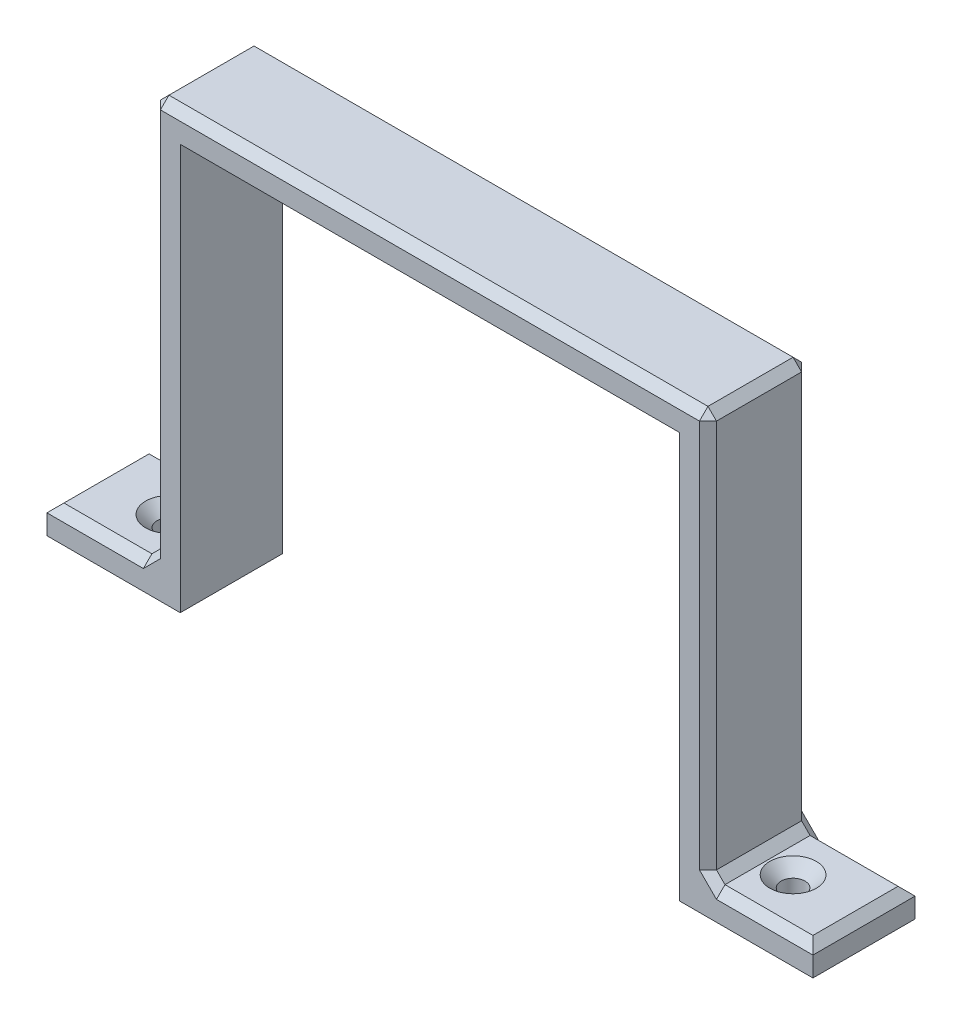
ISO-10303-21;
HEADER;
FILE_DESCRIPTION(('STEP AP214'),'2;1');
FILE_NAME('part.step','',(''),(''),'','','');
FILE_SCHEMA(('AUTOMOTIVE_DESIGN { 1 0 10303 214 1 1 1 1 }'));
ENDSEC;
DATA;
#1=APPLICATION_CONTEXT('core data for automotive mechanical design processes');
#2=APPLICATION_PROTOCOL_DEFINITION('international standard','automotive_design',2000,#1);
#3=PRODUCT_CONTEXT('',#1,'mechanical');
#4=PRODUCT('Part','Part','',(#3));
#5=PRODUCT_RELATED_PRODUCT_CATEGORY('part','',(#4));
#6=PRODUCT_DEFINITION_FORMATION('','',#4);
#7=PRODUCT_DEFINITION_CONTEXT('part definition',#1,'design');
#8=PRODUCT_DEFINITION('design','',#6,#7);
#9=PRODUCT_DEFINITION_SHAPE('','',#8);
#10=(LENGTH_UNIT() NAMED_UNIT(*) SI_UNIT(.MILLI.,.METRE.));
#11=(NAMED_UNIT(*) PLANE_ANGLE_UNIT() SI_UNIT($,.RADIAN.));
#12=(NAMED_UNIT(*) SI_UNIT($,.STERADIAN.) SOLID_ANGLE_UNIT());
#13=UNCERTAINTY_MEASURE_WITH_UNIT(LENGTH_MEASURE(1.E-05),#10,'distance_accuracy_value','');
#14=(GEOMETRIC_REPRESENTATION_CONTEXT(3) GLOBAL_UNCERTAINTY_ASSIGNED_CONTEXT((#13)) GLOBAL_UNIT_ASSIGNED_CONTEXT((#10,
#11,#12)) REPRESENTATION_CONTEXT('',''));
#15=CARTESIAN_POINT('',(0.,0.,0.));
#16=DIRECTION('',(0.,0.,1.));
#17=DIRECTION('',(1.,0.,0.));
#18=AXIS2_PLACEMENT_3D('',#15,#16,#17);
#19=CARTESIAN_POINT('',(0.,0.,-9.));
#20=DIRECTION('',(0.,0.,-1.));
#21=DIRECTION('',(-1.,0.,0.));
#22=AXIS2_PLACEMENT_3D('',#19,#20,#21);
#23=PLANE('',#22);
#24=DIRECTION('',(0.,-1.,0.));
#25=VECTOR('',#24,1.);
#26=CARTESIAN_POINT('',(-67.4999999999999,-22.85,-9.));
#27=LINE('',#26,#25);
#28=CARTESIAN_POINT('',(-67.4999999999999,-24.35,-9.));
#29=VERTEX_POINT('',#28);
#30=CARTESIAN_POINT('',(-67.4999999999999,-27.85,-9.));
#31=VERTEX_POINT('',#30);
#32=EDGE_CURVE('E442',#29,#31,#27,.T.);
#33=ORIENTED_EDGE('',*,*,#32,.F.);
#34=DIRECTION('',(1.,0.,0.));
#35=VECTOR('',#34,1.);
#36=CARTESIAN_POINT('',(-49.,-24.35,-9.));
#37=LINE('',#36,#35);
#38=CARTESIAN_POINT('',(-50.5,-24.35,-9.));
#39=VERTEX_POINT('',#38);
#40=EDGE_CURVE('E331',#29,#39,#37,.T.);
#41=ORIENTED_EDGE('',*,*,#40,.T.);
#42=DIRECTION('',(-0.707106781186544,-0.707106781186551,0.));
#43=VECTOR('',#42,1.);
#44=CARTESIAN_POINT('',(-13.0750000000002,13.0750000000001,-9.));
#45=LINE('',#44,#43);
#46=CARTESIAN_POINT('',(-49.,-22.85,-9.));
#47=VERTEX_POINT('',#46);
#48=EDGE_CURVE('E328',#47,#39,#45,.T.);
#49=ORIENTED_EDGE('',*,*,#48,.F.);
#50=DIRECTION('',(-0.707106781186544,-0.707106781186551,0.));
#51=VECTOR('',#50,1.);
#52=CARTESIAN_POINT('',(-13.0750000000002,13.0750000000001,-9.));
#53=LINE('',#52,#51);
#54=CARTESIAN_POINT('',(-47.5,-21.35,-9.));
#55=VERTEX_POINT('',#54);
#56=EDGE_CURVE('E325',#55,#47,#53,.T.);
#57=ORIENTED_EDGE('',*,*,#56,.F.);
#58=DIRECTION('',(0.,1.,0.));
#59=VECTOR('',#58,1.);
#60=CARTESIAN_POINT('',(-47.5,48.65,-9.));
#61=LINE('',#60,#59);
#62=CARTESIAN_POINT('',(-47.5,47.15,-9.));
#63=VERTEX_POINT('',#62);
#64=EDGE_CURVE('E323',#55,#63,#61,.T.);
#65=ORIENTED_EDGE('',*,*,#64,.T.);
#66=DIRECTION('',(1.,0.,0.));
#67=VECTOR('',#66,1.);
#68=CARTESIAN_POINT('',(49.,47.15,-9.));
#69=LINE('',#68,#67);
#70=CARTESIAN_POINT('',(47.5,47.15,-9.));
#71=VERTEX_POINT('',#70);
#72=EDGE_CURVE('E321',#63,#71,#69,.T.);
#73=ORIENTED_EDGE('',*,*,#72,.T.);
#74=DIRECTION('',(0.,-1.,0.));
#75=VECTOR('',#74,1.);
#76=CARTESIAN_POINT('',(47.5,-22.85,-9.));
#77=LINE('',#76,#75);
#78=CARTESIAN_POINT('',(47.5,-21.35,-9.));
#79=VERTEX_POINT('',#78);
#80=EDGE_CURVE('E319',#71,#79,#77,.T.);
#81=ORIENTED_EDGE('',*,*,#80,.T.);
#82=DIRECTION('',(-0.707106781186543,0.707106781186552,0.));
#83=VECTOR('',#82,1.);
#84=CARTESIAN_POINT('',(13.0750000000003,13.0750000000001,-9.));
#85=LINE('',#84,#83);
#86=CARTESIAN_POINT('',(49.,-22.85,-9.));
#87=VERTEX_POINT('',#86);
#88=EDGE_CURVE('E316',#87,#79,#85,.T.);
#89=ORIENTED_EDGE('',*,*,#88,.F.);
#90=DIRECTION('',(-0.707106781186543,0.707106781186552,0.));
#91=VECTOR('',#90,1.);
#92=CARTESIAN_POINT('',(13.0750000000003,13.0750000000001,-9.));
#93=LINE('',#92,#91);
#94=CARTESIAN_POINT('',(50.5,-24.35,-9.));
#95=VERTEX_POINT('',#94);
#96=EDGE_CURVE('E313',#95,#87,#93,.T.);
#97=ORIENTED_EDGE('',*,*,#96,.F.);
#98=DIRECTION('',(1.,0.,0.));
#99=VECTOR('',#98,1.);
#100=CARTESIAN_POINT('',(67.5,-24.35,-9.));
#101=LINE('',#100,#99);
#102=CARTESIAN_POINT('',(67.5,-24.35,-9.));
#103=VERTEX_POINT('',#102);
#104=EDGE_CURVE('E311',#95,#103,#101,.T.);
#105=ORIENTED_EDGE('',*,*,#104,.T.);
#106=DIRECTION('',(0.,1.,0.));
#107=VECTOR('',#106,1.);
#108=CARTESIAN_POINT('',(67.5,-22.85,-9.));
#109=LINE('',#108,#107);
#110=CARTESIAN_POINT('',(67.5,-27.85,-9.));
#111=VERTEX_POINT('',#110);
#112=EDGE_CURVE('E448',#111,#103,#109,.T.);
#113=ORIENTED_EDGE('',*,*,#112,.F.);
#114=DIRECTION('',(1.,0.,0.));
#115=VECTOR('',#114,1.);
#116=CARTESIAN_POINT('',(67.5,-27.85,-9.));
#117=LINE('',#116,#115);
#118=CARTESIAN_POINT('',(44.,-27.85,-9.));
#119=VERTEX_POINT('',#118);
#120=EDGE_CURVE('E237',#119,#111,#117,.T.);
#121=ORIENTED_EDGE('',*,*,#120,.F.);
#122=DIRECTION('',(0.,-1.,0.));
#123=VECTOR('',#122,1.);
#124=CARTESIAN_POINT('',(44.,-27.85,-9.));
#125=LINE('',#124,#123);
#126=CARTESIAN_POINT('',(44.,43.65,-9.));
#127=VERTEX_POINT('',#126);
#128=EDGE_CURVE('E233',#127,#119,#125,.T.);
#129=ORIENTED_EDGE('',*,*,#128,.F.);
#130=DIRECTION('',(1.,0.,0.));
#131=VECTOR('',#130,1.);
#132=CARTESIAN_POINT('',(44.,43.65,-9.));
#133=LINE('',#132,#131);
#134=CARTESIAN_POINT('',(-44.,43.65,-9.));
#135=VERTEX_POINT('',#134);
#136=EDGE_CURVE('E456',#135,#127,#133,.T.);
#137=ORIENTED_EDGE('',*,*,#136,.F.);
#138=DIRECTION('',(0.,1.,0.));
#139=VECTOR('',#138,1.);
#140=CARTESIAN_POINT('',(-44.,-27.85,-9.));
#141=LINE('',#140,#139);
#142=CARTESIAN_POINT('',(-44.,-27.85,-9.));
#143=VERTEX_POINT('',#142);
#144=EDGE_CURVE('E450',#143,#135,#141,.T.);
#145=ORIENTED_EDGE('',*,*,#144,.F.);
#146=DIRECTION('',(1.,0.,0.));
#147=VECTOR('',#146,1.);
#148=CARTESIAN_POINT('',(-67.4999999999999,-27.85,-9.));
#149=LINE('',#148,#147);
#150=EDGE_CURVE('E447',#31,#143,#149,.T.);
#151=ORIENTED_EDGE('',*,*,#150,.F.);
#152=EDGE_LOOP('',(#33,#41,#49,#57,#65,#73,#81,#89,#97,#105,#113,#121,#129,#137,#145,#151));
#153=FACE_BOUND('',#152,.T.);
#154=ADVANCED_FACE('F39',(#153),#23,.T.);
#155=CARTESIAN_POINT('',(0.,0.,9.));
#156=DIRECTION('',(0.,0.,-1.));
#157=DIRECTION('',(-1.,0.,0.));
#158=AXIS2_PLACEMENT_3D('',#155,#156,#157);
#159=PLANE('',#158);
#160=DIRECTION('',(0.707106781186544,0.707106781186551,0.));
#161=VECTOR('',#160,1.);
#162=CARTESIAN_POINT('',(-47.5,-21.35,9.));
#163=LINE('',#162,#161);
#164=CARTESIAN_POINT('',(-50.5,-24.35,9.));
#165=VERTEX_POINT('',#164);
#166=CARTESIAN_POINT('',(-49.,-22.85,9.));
#167=VERTEX_POINT('',#166);
#168=EDGE_CURVE('E297',#165,#167,#163,.T.);
#169=ORIENTED_EDGE('',*,*,#168,.F.);
#170=DIRECTION('',(-1.,0.,0.));
#171=VECTOR('',#170,1.);
#172=CARTESIAN_POINT('',(0.,-24.35,9.));
#173=LINE('',#172,#171);
#174=CARTESIAN_POINT('',(-67.4999999999999,-24.35,9.));
#175=VERTEX_POINT('',#174);
#176=EDGE_CURVE('E300',#165,#175,#173,.T.);
#177=ORIENTED_EDGE('',*,*,#176,.T.);
#178=DIRECTION('',(0.,-1.,0.));
#179=VECTOR('',#178,1.);
#180=CARTESIAN_POINT('',(-67.4999999999999,-22.85,9.));
#181=LINE('',#180,#179);
#182=CARTESIAN_POINT('',(-67.4999999999999,-27.85,9.));
#183=VERTEX_POINT('',#182);
#184=EDGE_CURVE('E223',#175,#183,#181,.T.);
#185=ORIENTED_EDGE('',*,*,#184,.T.);
#186=DIRECTION('',(1.,0.,0.));
#187=VECTOR('',#186,1.);
#188=CARTESIAN_POINT('',(-67.4999999999999,-27.85,9.));
#189=LINE('',#188,#187);
#190=CARTESIAN_POINT('',(-44.,-27.85,9.));
#191=VERTEX_POINT('',#190);
#192=EDGE_CURVE('E493',#183,#191,#189,.T.);
#193=ORIENTED_EDGE('',*,*,#192,.T.);
#194=DIRECTION('',(0.,1.,0.));
#195=VECTOR('',#194,1.);
#196=CARTESIAN_POINT('',(-44.,-27.85,9.));
#197=LINE('',#196,#195);
#198=CARTESIAN_POINT('',(-44.,43.65,9.));
#199=VERTEX_POINT('',#198);
#200=EDGE_CURVE('E472',#191,#199,#197,.T.);
#201=ORIENTED_EDGE('',*,*,#200,.T.);
#202=DIRECTION('',(1.,0.,0.));
#203=VECTOR('',#202,1.);
#204=CARTESIAN_POINT('',(44.,43.65,9.));
#205=LINE('',#204,#203);
#206=CARTESIAN_POINT('',(44.,43.65,9.));
#207=VERTEX_POINT('',#206);
#208=EDGE_CURVE('E483',#199,#207,#205,.T.);
#209=ORIENTED_EDGE('',*,*,#208,.T.);
#210=DIRECTION('',(0.,-1.,0.));
#211=VECTOR('',#210,1.);
#212=CARTESIAN_POINT('',(44.,-27.85,9.));
#213=LINE('',#212,#211);
#214=CARTESIAN_POINT('',(44.,-27.85,9.));
#215=VERTEX_POINT('',#214);
#216=EDGE_CURVE('E229',#207,#215,#213,.T.);
#217=ORIENTED_EDGE('',*,*,#216,.T.);
#218=DIRECTION('',(1.,0.,0.));
#219=VECTOR('',#218,1.);
#220=CARTESIAN_POINT('',(67.5,-27.85,9.));
#221=LINE('',#220,#219);
#222=CARTESIAN_POINT('',(67.5,-27.85,9.));
#223=VERTEX_POINT('',#222);
#224=EDGE_CURVE('E224',#215,#223,#221,.T.);
#225=ORIENTED_EDGE('',*,*,#224,.T.);
#226=DIRECTION('',(0.,1.,0.));
#227=VECTOR('',#226,1.);
#228=CARTESIAN_POINT('',(67.5,-22.85,9.));
#229=LINE('',#228,#227);
#230=CARTESIAN_POINT('',(67.5,-24.35,9.));
#231=VERTEX_POINT('',#230);
#232=EDGE_CURVE('E213',#223,#231,#229,.T.);
#233=ORIENTED_EDGE('',*,*,#232,.T.);
#234=DIRECTION('',(-1.,0.,0.));
#235=VECTOR('',#234,1.);
#236=CARTESIAN_POINT('',(0.,-24.35,9.));
#237=LINE('',#236,#235);
#238=CARTESIAN_POINT('',(50.5,-24.35,9.));
#239=VERTEX_POINT('',#238);
#240=EDGE_CURVE('E285',#231,#239,#237,.T.);
#241=ORIENTED_EDGE('',*,*,#240,.T.);
#242=DIRECTION('',(0.707106781186543,-0.707106781186552,0.));
#243=VECTOR('',#242,1.);
#244=CARTESIAN_POINT('',(50.5,-24.35,9.));
#245=LINE('',#244,#243);
#246=CARTESIAN_POINT('',(49.,-22.85,9.));
#247=VERTEX_POINT('',#246);
#248=EDGE_CURVE('E279',#247,#239,#245,.T.);
#249=ORIENTED_EDGE('',*,*,#248,.F.);
#250=DIRECTION('',(0.707106781186543,-0.707106781186552,0.));
#251=VECTOR('',#250,1.);
#252=CARTESIAN_POINT('',(50.5,-24.35,9.));
#253=LINE('',#252,#251);
#254=CARTESIAN_POINT('',(47.5,-21.35,9.));
#255=VERTEX_POINT('',#254);
#256=EDGE_CURVE('E282',#255,#247,#253,.T.);
#257=ORIENTED_EDGE('',*,*,#256,.F.);
#258=DIRECTION('',(0.,1.,0.));
#259=VECTOR('',#258,1.);
#260=CARTESIAN_POINT('',(47.5,0.,9.));
#261=LINE('',#260,#259);
#262=CARTESIAN_POINT('',(47.5,47.15,9.));
#263=VERTEX_POINT('',#262);
#264=EDGE_CURVE('E287',#255,#263,#261,.T.);
#265=ORIENTED_EDGE('',*,*,#264,.T.);
#266=DIRECTION('',(-1.,0.,0.));
#267=VECTOR('',#266,1.);
#268=CARTESIAN_POINT('',(0.,47.15,9.));
#269=LINE('',#268,#267);
#270=CARTESIAN_POINT('',(-47.5,47.15,9.));
#271=VERTEX_POINT('',#270);
#272=EDGE_CURVE('E289',#263,#271,#269,.T.);
#273=ORIENTED_EDGE('',*,*,#272,.T.);
#274=DIRECTION('',(0.,-1.,0.));
#275=VECTOR('',#274,1.);
#276=CARTESIAN_POINT('',(-47.5,0.,9.));
#277=LINE('',#276,#275);
#278=CARTESIAN_POINT('',(-47.5,-21.35,9.));
#279=VERTEX_POINT('',#278);
#280=EDGE_CURVE('E292',#271,#279,#277,.T.);
#281=ORIENTED_EDGE('',*,*,#280,.T.);
#282=DIRECTION('',(0.707106781186544,0.707106781186551,0.));
#283=VECTOR('',#282,1.);
#284=CARTESIAN_POINT('',(-47.5,-21.35,9.));
#285=LINE('',#284,#283);
#286=EDGE_CURVE('E294',#167,#279,#285,.T.);
#287=ORIENTED_EDGE('',*,*,#286,.F.);
#288=EDGE_LOOP('',(#169,#177,#185,#193,#201,#209,#217,#225,#233,#241,#249,#257,#265,#273,#281,#287));
#289=FACE_BOUND('',#288,.T.);
#290=ADVANCED_FACE('F227',(#289),#159,.F.);
#291=CARTESIAN_POINT('',(67.5,-27.85,9.));
#292=DIRECTION('',(0.,1.,0.));
#293=DIRECTION('',(-1.,0.,0.));
#294=AXIS2_PLACEMENT_3D('',#291,#292,#293);
#295=PLANE('',#294);
#296=CARTESIAN_POINT('',(55.,-27.85,0.));
#297=DIRECTION('',(0.,1.,0.));
#298=DIRECTION('',(-1.,0.,0.));
#299=AXIS2_PLACEMENT_3D('',#296,#297,#298);
#300=CIRCLE('',#299,2.1);
#301=CARTESIAN_POINT('',(52.9,-27.85,0.));
#302=VERTEX_POINT('',#301);
#303=EDGE_CURVE('E251',#302,#302,#300,.T.);
#304=ORIENTED_EDGE('',*,*,#303,.T.);
#305=EDGE_LOOP('',(#304));
#306=FACE_BOUND('',#305,.T.);
#307=ORIENTED_EDGE('',*,*,#120,.T.);
#308=DIRECTION('',(0.,0.,-1.));
#309=VECTOR('',#308,1.);
#310=CARTESIAN_POINT('',(67.5,-27.85,9.));
#311=LINE('',#310,#309);
#312=EDGE_CURVE('E218',#223,#111,#311,.T.);
#313=ORIENTED_EDGE('',*,*,#312,.F.);
#314=ORIENTED_EDGE('',*,*,#224,.F.);
#315=DIRECTION('',(0.,0.,-1.));
#316=VECTOR('',#315,1.);
#317=CARTESIAN_POINT('',(44.,-27.85,9.));
#318=LINE('',#317,#316);
#319=EDGE_CURVE('E459',#215,#119,#318,.T.);
#320=ORIENTED_EDGE('',*,*,#319,.T.);
#321=EDGE_LOOP('',(#307,#313,#314,#320));
#322=FACE_BOUND('',#321,.T.);
#323=ADVANCED_FACE('F235',(#306,#322),#295,.F.);
#324=CARTESIAN_POINT('',(67.5,-22.85,9.));
#325=DIRECTION('',(-1.,0.,0.));
#326=DIRECTION('',(0.,0.,1.));
#327=AXIS2_PLACEMENT_3D('',#324,#325,#326);
#328=PLANE('',#327);
#329=ORIENTED_EDGE('',*,*,#112,.T.);
#330=DIRECTION('',(0.,0.,1.));
#331=VECTOR('',#330,1.);
#332=CARTESIAN_POINT('',(67.5,-24.35,9.));
#333=LINE('',#332,#331);
#334=EDGE_CURVE('E11',#103,#231,#333,.T.);
#335=ORIENTED_EDGE('',*,*,#334,.T.);
#336=ORIENTED_EDGE('',*,*,#232,.F.);
#337=ORIENTED_EDGE('',*,*,#312,.T.);
#338=EDGE_LOOP('',(#329,#335,#336,#337));
#339=FACE_BOUND('',#338,.T.);
#340=ADVANCED_FACE('F216',(#339),#328,.F.);
#341=CARTESIAN_POINT('',(49.,-22.85,9.));
#342=DIRECTION('',(0.,-1.,0.));
#343=DIRECTION('',(0.,0.,-1.));
#344=AXIS2_PLACEMENT_3D('',#341,#342,#343);
#345=PLANE('',#344);
#346=DIRECTION('',(1.,0.,0.));
#347=VECTOR('',#346,1.);
#348=CARTESIAN_POINT('',(49.,-22.85,7.50000000000001));
#349=LINE('',#348,#347);
#350=CARTESIAN_POINT('',(50.5,-22.85,7.50000000000001));
#351=VERTEX_POINT('',#350);
#352=CARTESIAN_POINT('',(66.,-22.85,7.50000000000001));
#353=VERTEX_POINT('',#352);
#354=EDGE_CURVE('E57',#351,#353,#349,.T.);
#355=ORIENTED_EDGE('',*,*,#354,.T.);
#356=DIRECTION('',(0.,0.,-1.));
#357=VECTOR('',#356,1.);
#358=CARTESIAN_POINT('',(66.,-22.85,9.));
#359=LINE('',#358,#357);
#360=CARTESIAN_POINT('',(66.,-22.85,-7.50000000000001));
#361=VERTEX_POINT('',#360);
#362=EDGE_CURVE('E49',#353,#361,#359,.T.);
#363=ORIENTED_EDGE('',*,*,#362,.T.);
#364=DIRECTION('',(-1.,0.,0.));
#365=VECTOR('',#364,1.);
#366=CARTESIAN_POINT('',(49.,-22.85,-7.50000000000001));
#367=LINE('',#366,#365);
#368=CARTESIAN_POINT('',(50.5,-22.85,-7.50000000000001));
#369=VERTEX_POINT('',#368);
#370=EDGE_CURVE('E344',#361,#369,#367,.T.);
#371=ORIENTED_EDGE('',*,*,#370,.T.);
#372=DIRECTION('',(0.,0.,1.));
#373=VECTOR('',#372,1.);
#374=CARTESIAN_POINT('',(50.5,-22.85,9.));
#375=LINE('',#374,#373);
#376=EDGE_CURVE('E62',#369,#351,#375,.T.);
#377=ORIENTED_EDGE('',*,*,#376,.T.);
#378=EDGE_LOOP('',(#355,#363,#371,#377));
#379=FACE_BOUND('',#378,.T.);
#380=CARTESIAN_POINT('',(55.,-22.85,0.));
#381=DIRECTION('',(0.,-1.,0.));
#382=DIRECTION('',(0.,0.,-1.));
#383=AXIS2_PLACEMENT_3D('',#380,#381,#382);
#384=CIRCLE('',#383,4.10000000000001);
#385=CARTESIAN_POINT('',(55.,-22.85,-4.10000000000001));
#386=VERTEX_POINT('',#385);
#387=EDGE_CURVE('E255',#386,#386,#384,.T.);
#388=ORIENTED_EDGE('',*,*,#387,.T.);
#389=EDGE_LOOP('',(#388));
#390=FACE_BOUND('',#389,.T.);
#391=ADVANCED_FACE('F934',(#379,#390),#345,.F.);
#392=CARTESIAN_POINT('',(49.,48.65,9.));
#393=DIRECTION('',(-1.,0.,0.));
#394=DIRECTION('',(0.,-1.,0.));
#395=AXIS2_PLACEMENT_3D('',#392,#393,#394);
#396=PLANE('',#395);
#397=DIRECTION('',(0.,1.,0.));
#398=VECTOR('',#397,1.);
#399=CARTESIAN_POINT('',(49.,48.65,-7.5));
#400=LINE('',#399,#398);
#401=CARTESIAN_POINT('',(49.,-21.35,-7.5));
#402=VERTEX_POINT('',#401);
#403=CARTESIAN_POINT('',(49.,47.15,-7.5));
#404=VERTEX_POINT('',#403);
#405=EDGE_CURVE('E272',#402,#404,#400,.T.);
#406=ORIENTED_EDGE('',*,*,#405,.T.);
#407=DIRECTION('',(0.,0.,1.));
#408=VECTOR('',#407,1.);
#409=CARTESIAN_POINT('',(49.,47.15,9.));
#410=LINE('',#409,#408);
#411=CARTESIAN_POINT('',(49.,47.15,7.50000000000001));
#412=VERTEX_POINT('',#411);
#413=EDGE_CURVE('E276',#404,#412,#410,.T.);
#414=ORIENTED_EDGE('',*,*,#413,.T.);
#415=DIRECTION('',(0.,-1.,0.));
#416=VECTOR('',#415,1.);
#417=CARTESIAN_POINT('',(49.,48.65,7.50000000000001));
#418=LINE('',#417,#416);
#419=CARTESIAN_POINT('',(49.,-21.35,7.50000000000001));
#420=VERTEX_POINT('',#419);
#421=EDGE_CURVE('E274',#412,#420,#418,.T.);
#422=ORIENTED_EDGE('',*,*,#421,.T.);
#423=DIRECTION('',(0.,0.,-1.));
#424=VECTOR('',#423,1.);
#425=CARTESIAN_POINT('',(49.,-21.35,-9.));
#426=LINE('',#425,#424);
#427=EDGE_CURVE('E270',#420,#402,#426,.T.);
#428=ORIENTED_EDGE('',*,*,#427,.T.);
#429=EDGE_LOOP('',(#406,#414,#422,#428));
#430=FACE_BOUND('',#429,.T.);
#431=ADVANCED_FACE('F923',(#430),#396,.F.);
#432=CARTESIAN_POINT('',(-49.,48.65,9.));
#433=DIRECTION('',(0.,-1.,0.));
#434=DIRECTION('',(1.,0.,0.));
#435=AXIS2_PLACEMENT_3D('',#432,#433,#434);
#436=PLANE('',#435);
#437=DIRECTION('',(1.,0.,0.));
#438=VECTOR('',#437,1.);
#439=CARTESIAN_POINT('',(-49.,48.65,7.49999999999998));
#440=LINE('',#439,#438);
#441=CARTESIAN_POINT('',(-47.5,48.65,7.49999999999998));
#442=VERTEX_POINT('',#441);
#443=CARTESIAN_POINT('',(47.5,48.65,7.49999999999998));
#444=VERTEX_POINT('',#443);
#445=EDGE_CURVE('E265',#442,#444,#440,.T.);
#446=ORIENTED_EDGE('',*,*,#445,.T.);
#447=DIRECTION('',(0.,0.,-1.));
#448=VECTOR('',#447,1.);
#449=CARTESIAN_POINT('',(47.5,48.65,9.));
#450=LINE('',#449,#448);
#451=CARTESIAN_POINT('',(47.5,48.65,-7.49999999999998));
#452=VERTEX_POINT('',#451);
#453=EDGE_CURVE('E267',#444,#452,#450,.T.);
#454=ORIENTED_EDGE('',*,*,#453,.T.);
#455=DIRECTION('',(-1.,0.,0.));
#456=VECTOR('',#455,1.);
#457=CARTESIAN_POINT('',(-49.,48.65,-7.49999999999998));
#458=LINE('',#457,#456);
#459=CARTESIAN_POINT('',(-47.5,48.65,-7.49999999999998));
#460=VERTEX_POINT('',#459);
#461=EDGE_CURVE('E261',#452,#460,#458,.T.);
#462=ORIENTED_EDGE('',*,*,#461,.T.);
#463=DIRECTION('',(0.,0.,1.));
#464=VECTOR('',#463,1.);
#465=CARTESIAN_POINT('',(-47.5,48.65,9.));
#466=LINE('',#465,#464);
#467=EDGE_CURVE('E263',#460,#442,#466,.T.);
#468=ORIENTED_EDGE('',*,*,#467,.T.);
#469=EDGE_LOOP('',(#446,#454,#462,#468));
#470=FACE_BOUND('',#469,.T.);
#471=ADVANCED_FACE('F912',(#470),#436,.F.);
#472=CARTESIAN_POINT('',(-49.,48.65,9.));
#473=DIRECTION('',(1.,0.,0.));
#474=DIRECTION('',(0.,1.,0.));
#475=AXIS2_PLACEMENT_3D('',#472,#473,#474);
#476=PLANE('',#475);
#477=DIRECTION('',(0.,1.,0.));
#478=VECTOR('',#477,1.);
#479=CARTESIAN_POINT('',(-49.,48.65,7.49999999999997));
#480=LINE('',#479,#478);
#481=CARTESIAN_POINT('',(-49.,-21.35,7.49999999999997));
#482=VERTEX_POINT('',#481);
#483=CARTESIAN_POINT('',(-49.,47.15,7.49999999999997));
#484=VERTEX_POINT('',#483);
#485=EDGE_CURVE('E306',#482,#484,#480,.T.);
#486=ORIENTED_EDGE('',*,*,#485,.T.);
#487=DIRECTION('',(0.,0.,-1.));
#488=VECTOR('',#487,1.);
#489=CARTESIAN_POINT('',(-49.,47.15,9.));
#490=LINE('',#489,#488);
#491=CARTESIAN_POINT('',(-49.,47.15,-7.49999999999997));
#492=VERTEX_POINT('',#491);
#493=EDGE_CURVE('E308',#484,#492,#490,.T.);
#494=ORIENTED_EDGE('',*,*,#493,.T.);
#495=DIRECTION('',(0.,-1.,0.));
#496=VECTOR('',#495,1.);
#497=CARTESIAN_POINT('',(-49.,-22.85,-7.49999999999997));
#498=LINE('',#497,#496);
#499=CARTESIAN_POINT('',(-49.,-21.35,-7.49999999999997));
#500=VERTEX_POINT('',#499);
#501=EDGE_CURVE('E304',#492,#500,#498,.T.);
#502=ORIENTED_EDGE('',*,*,#501,.T.);
#503=DIRECTION('',(0.,0.,1.));
#504=VECTOR('',#503,1.);
#505=CARTESIAN_POINT('',(-49.,-21.35,9.));
#506=LINE('',#505,#504);
#507=EDGE_CURVE('E302',#500,#482,#506,.T.);
#508=ORIENTED_EDGE('',*,*,#507,.T.);
#509=EDGE_LOOP('',(#486,#494,#502,#508));
#510=FACE_BOUND('',#509,.T.);
#511=ADVANCED_FACE('F901',(#510),#476,.F.);
#512=CARTESIAN_POINT('',(-49.,-22.85,9.));
#513=DIRECTION('',(0.,-1.,0.));
#514=DIRECTION('',(1.,0.,0.));
#515=AXIS2_PLACEMENT_3D('',#512,#513,#514);
#516=PLANE('',#515);
#517=DIRECTION('',(1.,0.,0.));
#518=VECTOR('',#517,1.);
#519=CARTESIAN_POINT('',(-49.,-22.85,7.49999999999998));
#520=LINE('',#519,#518);
#521=CARTESIAN_POINT('',(-65.9999999999999,-22.85,7.49999999999998));
#522=VERTEX_POINT('',#521);
#523=CARTESIAN_POINT('',(-50.5,-22.85,7.49999999999998));
#524=VERTEX_POINT('',#523);
#525=EDGE_CURVE('E337',#522,#524,#520,.T.);
#526=ORIENTED_EDGE('',*,*,#525,.T.);
#527=DIRECTION('',(0.,0.,-1.));
#528=VECTOR('',#527,1.);
#529=CARTESIAN_POINT('',(-50.5,-22.85,-9.));
#530=LINE('',#529,#528);
#531=CARTESIAN_POINT('',(-50.5,-22.85,-7.49999999999998));
#532=VERTEX_POINT('',#531);
#533=EDGE_CURVE('E339',#524,#532,#530,.T.);
#534=ORIENTED_EDGE('',*,*,#533,.T.);
#535=DIRECTION('',(-1.,0.,0.));
#536=VECTOR('',#535,1.);
#537=CARTESIAN_POINT('',(-67.4999999999999,-22.85,-7.49999999999998));
#538=LINE('',#537,#536);
#539=CARTESIAN_POINT('',(-65.9999999999999,-22.85,-7.49999999999998));
#540=VERTEX_POINT('',#539);
#541=EDGE_CURVE('E333',#532,#540,#538,.T.);
#542=ORIENTED_EDGE('',*,*,#541,.T.);
#543=DIRECTION('',(0.,0.,1.));
#544=VECTOR('',#543,1.);
#545=CARTESIAN_POINT('',(-65.9999999999999,-22.85,9.));
#546=LINE('',#545,#544);
#547=EDGE_CURVE('E335',#540,#522,#546,.T.);
#548=ORIENTED_EDGE('',*,*,#547,.T.);
#549=EDGE_LOOP('',(#526,#534,#542,#548));
#550=FACE_BOUND('',#549,.T.);
#551=CARTESIAN_POINT('',(-55.,-22.85,0.));
#552=DIRECTION('',(0.,-1.,0.));
#553=DIRECTION('',(1.,0.,0.));
#554=AXIS2_PLACEMENT_3D('',#551,#552,#553);
#555=CIRCLE('',#554,4.10000000000003);
#556=CARTESIAN_POINT('',(-50.8999999999999,-22.85,0.));
#557=VERTEX_POINT('',#556);
#558=EDGE_CURVE('E238',#557,#557,#555,.T.);
#559=ORIENTED_EDGE('',*,*,#558,.T.);
#560=EDGE_LOOP('',(#559));
#561=FACE_BOUND('',#560,.T.);
#562=ADVANCED_FACE('F503',(#550,#561),#516,.F.);
#563=CARTESIAN_POINT('',(-67.4999999999999,-22.85,9.));
#564=DIRECTION('',(1.,0.,0.));
#565=DIRECTION('',(0.,0.,-1.));
#566=AXIS2_PLACEMENT_3D('',#563,#564,#565);
#567=PLANE('',#566);
#568=ORIENTED_EDGE('',*,*,#184,.F.);
#569=DIRECTION('',(0.,0.,-1.));
#570=VECTOR('',#569,1.);
#571=CARTESIAN_POINT('',(-67.4999999999999,-24.35,9.));
#572=LINE('',#571,#570);
#573=EDGE_CURVE('E342',#175,#29,#572,.T.);
#574=ORIENTED_EDGE('',*,*,#573,.T.);
#575=ORIENTED_EDGE('',*,*,#32,.T.);
#576=DIRECTION('',(0.,0.,-1.));
#577=VECTOR('',#576,1.);
#578=CARTESIAN_POINT('',(-67.4999999999999,-27.85,9.));
#579=LINE('',#578,#577);
#580=EDGE_CURVE('E239',#183,#31,#579,.T.);
#581=ORIENTED_EDGE('',*,*,#580,.F.);
#582=EDGE_LOOP('',(#568,#574,#575,#581));
#583=FACE_BOUND('',#582,.T.);
#584=ADVANCED_FACE('F440',(#583),#567,.F.);
#585=CARTESIAN_POINT('',(-67.4999999999999,-27.85,9.));
#586=DIRECTION('',(0.,1.,0.));
#587=DIRECTION('',(-1.,0.,0.));
#588=AXIS2_PLACEMENT_3D('',#585,#586,#587);
#589=PLANE('',#588);
#590=CARTESIAN_POINT('',(-55.,-27.85,0.));
#591=DIRECTION('',(0.,1.,0.));
#592=DIRECTION('',(-1.,0.,0.));
#593=AXIS2_PLACEMENT_3D('',#590,#591,#592);
#594=CIRCLE('',#593,2.1);
#595=CARTESIAN_POINT('',(-57.1,-27.85,0.));
#596=VERTEX_POINT('',#595);
#597=EDGE_CURVE('E249',#596,#596,#594,.T.);
#598=ORIENTED_EDGE('',*,*,#597,.T.);
#599=EDGE_LOOP('',(#598));
#600=FACE_BOUND('',#599,.T.);
#601=ORIENTED_EDGE('',*,*,#150,.T.);
#602=DIRECTION('',(0.,0.,-1.));
#603=VECTOR('',#602,1.);
#604=CARTESIAN_POINT('',(-44.,-27.85,9.));
#605=LINE('',#604,#603);
#606=EDGE_CURVE('E245',#191,#143,#605,.T.);
#607=ORIENTED_EDGE('',*,*,#606,.F.);
#608=ORIENTED_EDGE('',*,*,#192,.F.);
#609=ORIENTED_EDGE('',*,*,#580,.T.);
#610=EDGE_LOOP('',(#601,#607,#608,#609));
#611=FACE_BOUND('',#610,.T.);
#612=ADVANCED_FACE('F494',(#600,#611),#589,.F.);
#613=CARTESIAN_POINT('',(-44.,-27.85,9.));
#614=DIRECTION('',(-1.,0.,0.));
#615=DIRECTION('',(0.,-1.,0.));
#616=AXIS2_PLACEMENT_3D('',#613,#614,#615);
#617=PLANE('',#616);
#618=ORIENTED_EDGE('',*,*,#144,.T.);
#619=DIRECTION('',(0.,0.,-1.));
#620=VECTOR('',#619,1.);
#621=CARTESIAN_POINT('',(-44.,43.65,9.));
#622=LINE('',#621,#620);
#623=EDGE_CURVE('E464',#199,#135,#622,.T.);
#624=ORIENTED_EDGE('',*,*,#623,.F.);
#625=ORIENTED_EDGE('',*,*,#200,.F.);
#626=ORIENTED_EDGE('',*,*,#606,.T.);
#627=EDGE_LOOP('',(#618,#624,#625,#626));
#628=FACE_BOUND('',#627,.T.);
#629=ADVANCED_FACE('F470',(#628),#617,.F.);
#630=CARTESIAN_POINT('',(44.,43.65,9.));
#631=DIRECTION('',(0.,1.,0.));
#632=DIRECTION('',(-1.,0.,0.));
#633=AXIS2_PLACEMENT_3D('',#630,#631,#632);
#634=PLANE('',#633);
#635=ORIENTED_EDGE('',*,*,#136,.T.);
#636=DIRECTION('',(0.,0.,-1.));
#637=VECTOR('',#636,1.);
#638=CARTESIAN_POINT('',(44.,43.65,9.));
#639=LINE('',#638,#637);
#640=EDGE_CURVE('E461',#207,#127,#639,.T.);
#641=ORIENTED_EDGE('',*,*,#640,.F.);
#642=ORIENTED_EDGE('',*,*,#208,.F.);
#643=ORIENTED_EDGE('',*,*,#623,.T.);
#644=EDGE_LOOP('',(#635,#641,#642,#643));
#645=FACE_BOUND('',#644,.T.);
#646=ADVANCED_FACE('F479',(#645),#634,.F.);
#647=CARTESIAN_POINT('',(44.,-27.85,9.));
#648=DIRECTION('',(1.,0.,0.));
#649=DIRECTION('',(0.,0.,-1.));
#650=AXIS2_PLACEMENT_3D('',#647,#648,#649);
#651=PLANE('',#650);
#652=ORIENTED_EDGE('',*,*,#128,.T.);
#653=ORIENTED_EDGE('',*,*,#319,.F.);
#654=ORIENTED_EDGE('',*,*,#216,.F.);
#655=ORIENTED_EDGE('',*,*,#640,.T.);
#656=EDGE_LOOP('',(#652,#653,#654,#655));
#657=FACE_BOUND('',#656,.T.);
#658=ADVANCED_FACE('F482',(#657),#651,.F.);
#659=CARTESIAN_POINT('',(-55.,-18.85,0.));
#660=DIRECTION('',(0.,-1.,0.));
#661=DIRECTION('',(0.,0.,-1.));
#662=AXIS2_PLACEMENT_3D('',#659,#660,#661);
#663=CYLINDRICAL_SURFACE('',#662,2.1);
#664=CARTESIAN_POINT('',(-55.,-24.8500000000001,0.));
#665=DIRECTION('',(0.,-1.,0.));
#666=DIRECTION('',(0.,0.,-1.));
#667=AXIS2_PLACEMENT_3D('',#664,#665,#666);
#668=CIRCLE('',#667,2.1);
#669=CARTESIAN_POINT('',(-55.,-24.8500000000001,-2.10000000000001));
#670=VERTEX_POINT('',#669);
#671=EDGE_CURVE('E242',#670,#670,#668,.F.);
#672=ORIENTED_EDGE('',*,*,#671,.T.);
#673=EDGE_LOOP('',(#672));
#674=FACE_BOUND('',#673,.T.);
#675=ORIENTED_EDGE('',*,*,#597,.F.);
#676=EDGE_LOOP('',(#675));
#677=FACE_BOUND('',#676,.T.);
#678=ADVANCED_FACE('F515',(#674,#677),#663,.F.);
#679=CARTESIAN_POINT('',(55.,-18.85,0.));
#680=DIRECTION('',(0.,-1.,0.));
#681=DIRECTION('',(0.,0.,-1.));
#682=AXIS2_PLACEMENT_3D('',#679,#680,#681);
#683=CYLINDRICAL_SURFACE('',#682,2.1);
#684=CARTESIAN_POINT('',(55.,-24.85,0.));
#685=DIRECTION('',(0.,-1.,0.));
#686=DIRECTION('',(0.,0.,-1.));
#687=AXIS2_PLACEMENT_3D('',#684,#685,#686);
#688=CIRCLE('',#687,2.1);
#689=CARTESIAN_POINT('',(55.,-24.85,-2.1));
#690=VERTEX_POINT('',#689);
#691=EDGE_CURVE('E258',#690,#690,#688,.F.);
#692=ORIENTED_EDGE('',*,*,#691,.T.);
#693=EDGE_LOOP('',(#692));
#694=FACE_BOUND('',#693,.T.);
#695=ORIENTED_EDGE('',*,*,#303,.F.);
#696=EDGE_LOOP('',(#695));
#697=FACE_BOUND('',#696,.T.);
#698=ADVANCED_FACE('F532',(#694,#697),#683,.F.);
#699=CARTESIAN_POINT('',(-55.,-22.85,0.));
#700=DIRECTION('',(0.,1.,0.));
#701=DIRECTION('',(0.,0.,1.));
#702=AXIS2_PLACEMENT_3D('',#699,#700,#701);
#703=CONICAL_SURFACE('',#702,4.10000000000003,0.785398163397447);
#704=ORIENTED_EDGE('',*,*,#671,.F.);
#705=EDGE_LOOP('',(#704));
#706=FACE_BOUND('',#705,.T.);
#707=ORIENTED_EDGE('',*,*,#558,.F.);
#708=EDGE_LOOP('',(#707));
#709=FACE_BOUND('',#708,.T.);
#710=ADVANCED_FACE('F539',(#706,#709),#703,.F.);
#711=CARTESIAN_POINT('',(55.,-22.85,0.));
#712=DIRECTION('',(0.,1.,0.));
#713=DIRECTION('',(0.,0.,1.));
#714=AXIS2_PLACEMENT_3D('',#711,#712,#713);
#715=CONICAL_SURFACE('',#714,4.10000000000001,0.785398163397447);
#716=ORIENTED_EDGE('',*,*,#691,.F.);
#717=EDGE_LOOP('',(#716));
#718=FACE_BOUND('',#717,.T.);
#719=ORIENTED_EDGE('',*,*,#387,.F.);
#720=EDGE_LOOP('',(#719));
#721=FACE_BOUND('',#720,.T.);
#722=ADVANCED_FACE('F547',(#718,#721),#715,.F.);
#723=CARTESIAN_POINT('',(-67.4999999999999,-24.35,9.));
#724=DIRECTION('',(0.707106781186551,-0.707106781186544,0.));
#725=DIRECTION('',(0.,0.,-1.));
#726=AXIS2_PLACEMENT_3D('',#723,#724,#725);
#727=PLANE('',#726);
#728=DIRECTION('',(-0.577350269189624,-0.57735026918963,-0.577350269189624));
#729=VECTOR('',#728,1.);
#730=CARTESIAN_POINT('',(-60.3333333333333,-17.1833333333333,-1.83333333333337));
#731=LINE('',#730,#729);
#732=EDGE_CURVE('E421',#29,#540,#731,.F.);
#733=ORIENTED_EDGE('',*,*,#732,.F.);
#734=ORIENTED_EDGE('',*,*,#573,.F.);
#735=DIRECTION('',(0.577350269189624,0.57735026918963,-0.577350269189624));
#736=VECTOR('',#735,1.);
#737=CARTESIAN_POINT('',(-67.4999999999999,-24.35,9.));
#738=LINE('',#737,#736);
#739=EDGE_CURVE('E44',#522,#175,#738,.F.);
#740=ORIENTED_EDGE('',*,*,#739,.F.);
#741=ORIENTED_EDGE('',*,*,#547,.F.);
#742=EDGE_LOOP('',(#733,#734,#740,#741));
#743=FACE_BOUND('',#742,.T.);
#744=ADVANCED_FACE('F42',(#743),#727,.F.);
#745=CARTESIAN_POINT('',(0.,-24.35,9.));
#746=DIRECTION('',(0.,-0.707106781186544,-0.707106781186551));
#747=DIRECTION('',(-1.,0.,0.));
#748=AXIS2_PLACEMENT_3D('',#745,#746,#747);
#749=PLANE('',#748);
#750=ORIENTED_EDGE('',*,*,#739,.T.);
#751=ORIENTED_EDGE('',*,*,#176,.F.);
#752=DIRECTION('',(0.,-0.707106781186551,0.707106781186544));
#753=VECTOR('',#752,1.);
#754=CARTESIAN_POINT('',(-50.5,-22.85,7.49999999999998));
#755=LINE('',#754,#753);
#756=EDGE_CURVE('E419',#524,#165,#755,.T.);
#757=ORIENTED_EDGE('',*,*,#756,.F.);
#758=ORIENTED_EDGE('',*,*,#525,.F.);
#759=EDGE_LOOP('',(#750,#751,#757,#758));
#760=FACE_BOUND('',#759,.T.);
#761=ADVANCED_FACE('F432',(#760),#749,.F.);
#762=CARTESIAN_POINT('',(-50.5,-22.85,9.));
#763=DIRECTION('',(-0.707106781186551,0.707106781186544,0.));
#764=DIRECTION('',(0.,0.,1.));
#765=AXIS2_PLACEMENT_3D('',#762,#763,#764);
#766=PLANE('',#765);
#767=DIRECTION('',(-0.707106781186544,-0.707106781186551,0.));
#768=VECTOR('',#767,1.);
#769=CARTESIAN_POINT('',(-50.5,-22.85,-7.49999999999998));
#770=LINE('',#769,#768);
#771=EDGE_CURVE('E413',#532,#500,#770,.F.);
#772=ORIENTED_EDGE('',*,*,#771,.F.);
#773=ORIENTED_EDGE('',*,*,#533,.F.);
#774=DIRECTION('',(0.707106781186544,0.707106781186551,0.));
#775=VECTOR('',#774,1.);
#776=CARTESIAN_POINT('',(-49.,-21.35,7.49999999999997));
#777=LINE('',#776,#775);
#778=EDGE_CURVE('E416',#482,#524,#777,.F.);
#779=ORIENTED_EDGE('',*,*,#778,.F.);
#780=ORIENTED_EDGE('',*,*,#507,.F.);
#781=EDGE_LOOP('',(#772,#773,#779,#780));
#782=FACE_BOUND('',#781,.T.);
#783=ADVANCED_FACE('F568',(#782),#766,.T.);
#784=CARTESIAN_POINT('',(-49.,-22.85,-7.49999999999998));
#785=DIRECTION('',(0.,0.707106781186544,-0.707106781186551));
#786=DIRECTION('',(1.,0.,0.));
#787=AXIS2_PLACEMENT_3D('',#784,#785,#786);
#788=PLANE('',#787);
#789=ORIENTED_EDGE('',*,*,#732,.T.);
#790=ORIENTED_EDGE('',*,*,#541,.F.);
#791=DIRECTION('',(0.,0.707106781186551,0.707106781186544));
#792=VECTOR('',#791,1.);
#793=CARTESIAN_POINT('',(-50.5,-24.35,-9.));
#794=LINE('',#793,#792);
#795=EDGE_CURVE('E411',#39,#532,#794,.T.);
#796=ORIENTED_EDGE('',*,*,#795,.F.);
#797=ORIENTED_EDGE('',*,*,#40,.F.);
#798=EDGE_LOOP('',(#789,#790,#796,#797));
#799=FACE_BOUND('',#798,.T.);
#800=ADVANCED_FACE('F574',(#799),#788,.T.);
#801=CARTESIAN_POINT('',(-49.,-21.35,7.49999999999997));
#802=DIRECTION('',(-0.577350269189627,0.577350269189627,0.577350269189624));
#803=DIRECTION('',(-0.707106781186547,-0.707106781186547,0.));
#804=AXIS2_PLACEMENT_3D('',#801,#802,#803);
#805=PLANE('',#804);
#806=ORIENTED_EDGE('',*,*,#168,.T.);
#807=ORIENTED_EDGE('',*,*,#286,.T.);
#808=DIRECTION('',(-0.707106781186546,0.,-0.707106781186549));
#809=VECTOR('',#808,1.);
#810=CARTESIAN_POINT('',(-47.5,-21.35,9.));
#811=LINE('',#810,#809);
#812=EDGE_CURVE('E405',#482,#279,#811,.F.);
#813=ORIENTED_EDGE('',*,*,#812,.F.);
#814=ORIENTED_EDGE('',*,*,#778,.T.);
#815=ORIENTED_EDGE('',*,*,#756,.T.);
#816=EDGE_LOOP('',(#806,#807,#813,#814,#815));
#817=FACE_BOUND('',#816,.T.);
#818=ADVANCED_FACE('F582',(#817),#805,.T.);
#819=CARTESIAN_POINT('',(-50.5,-22.85,-7.49999999999998));
#820=DIRECTION('',(-0.577350269189624,0.577350269189624,-0.577350269189629));
#821=DIRECTION('',(-0.707106781186551,0.,0.707106781186544));
#822=AXIS2_PLACEMENT_3D('',#819,#820,#821);
#823=PLANE('',#822);
#824=ORIENTED_EDGE('',*,*,#795,.T.);
#825=ORIENTED_EDGE('',*,*,#771,.T.);
#826=DIRECTION('',(0.707106781186546,0.,-0.707106781186549));
#827=VECTOR('',#826,1.);
#828=CARTESIAN_POINT('',(-49.,-21.35,-7.49999999999997));
#829=LINE('',#828,#827);
#830=EDGE_CURVE('E402',#55,#500,#829,.F.);
#831=ORIENTED_EDGE('',*,*,#830,.F.);
#832=ORIENTED_EDGE('',*,*,#56,.T.);
#833=ORIENTED_EDGE('',*,*,#48,.T.);
#834=EDGE_LOOP('',(#824,#825,#831,#832,#833));
#835=FACE_BOUND('',#834,.T.);
#836=ADVANCED_FACE('F589',(#835),#823,.T.);
#837=CARTESIAN_POINT('',(66.,-22.85,9.));
#838=DIRECTION('',(-0.707106781186551,-0.707106781186544,0.));
#839=DIRECTION('',(0.,0.,-1.));
#840=AXIS2_PLACEMENT_3D('',#837,#838,#839);
#841=PLANE('',#840);
#842=DIRECTION('',(-0.577350269189624,0.577350269189629,0.577350269189624));
#843=VECTOR('',#842,1.);
#844=CARTESIAN_POINT('',(60.3333333333334,-17.1833333333333,-1.83333333333338));
#845=LINE('',#844,#843);
#846=EDGE_CURVE('E399',#361,#103,#845,.F.);
#847=ORIENTED_EDGE('',*,*,#846,.F.);
#848=ORIENTED_EDGE('',*,*,#362,.F.);
#849=DIRECTION('',(-0.577350269189624,0.577350269189629,-0.577350269189624));
#850=VECTOR('',#849,1.);
#851=CARTESIAN_POINT('',(45.0000000000001,-1.84999999999994,-13.4999999999999));
#852=LINE('',#851,#850);
#853=EDGE_CURVE('E408',#231,#353,#852,.T.);
#854=ORIENTED_EDGE('',*,*,#853,.F.);
#855=ORIENTED_EDGE('',*,*,#334,.F.);
#856=EDGE_LOOP('',(#847,#848,#854,#855));
#857=FACE_BOUND('',#856,.T.);
#858=ADVANCED_FACE('F597',(#857),#841,.F.);
#859=CARTESIAN_POINT('',(0.,-24.35,9.));
#860=DIRECTION('',(0.,-0.707106781186544,-0.707106781186551));
#861=DIRECTION('',(-1.,0.,0.));
#862=AXIS2_PLACEMENT_3D('',#859,#860,#861);
#863=PLANE('',#862);
#864=ORIENTED_EDGE('',*,*,#853,.T.);
#865=ORIENTED_EDGE('',*,*,#354,.F.);
#866=DIRECTION('',(0.,0.707106781186551,-0.707106781186544));
#867=VECTOR('',#866,1.);
#868=CARTESIAN_POINT('',(50.5,-24.35,9.));
#869=LINE('',#868,#867);
#870=EDGE_CURVE('E393',#239,#351,#869,.T.);
#871=ORIENTED_EDGE('',*,*,#870,.F.);
#872=ORIENTED_EDGE('',*,*,#240,.F.);
#873=EDGE_LOOP('',(#864,#865,#871,#872));
#874=FACE_BOUND('',#873,.T.);
#875=ADVANCED_FACE('F605',(#874),#863,.F.);
#876=CARTESIAN_POINT('',(-47.5,0.,9.));
#877=DIRECTION('',(0.707106781186549,0.,-0.707106781186546));
#878=DIRECTION('',(0.,-1.,0.));
#879=AXIS2_PLACEMENT_3D('',#876,#877,#878);
#880=PLANE('',#879);
#881=ORIENTED_EDGE('',*,*,#812,.T.);
#882=ORIENTED_EDGE('',*,*,#280,.F.);
#883=DIRECTION('',(-0.707106781186546,0.,-0.707106781186549));
#884=VECTOR('',#883,1.);
#885=CARTESIAN_POINT('',(-47.5,47.15,9.));
#886=LINE('',#885,#884);
#887=EDGE_CURVE('E390',#484,#271,#886,.F.);
#888=ORIENTED_EDGE('',*,*,#887,.F.);
#889=ORIENTED_EDGE('',*,*,#485,.F.);
#890=EDGE_LOOP('',(#881,#882,#888,#889));
#891=FACE_BOUND('',#890,.T.);
#892=ADVANCED_FACE('F613',(#891),#880,.F.);
#893=CARTESIAN_POINT('',(-49.,47.15,9.));
#894=DIRECTION('',(0.707106781186551,-0.707106781186544,0.));
#895=DIRECTION('',(0.,0.,-1.));
#896=AXIS2_PLACEMENT_3D('',#893,#894,#895);
#897=PLANE('',#896);
#898=DIRECTION('',(-0.707106781186544,-0.707106781186551,0.));
#899=VECTOR('',#898,1.);
#900=CARTESIAN_POINT('',(-49.,47.15,-7.49999999999997));
#901=LINE('',#900,#899);
#902=EDGE_CURVE('E384',#492,#460,#901,.F.);
#903=ORIENTED_EDGE('',*,*,#902,.F.);
#904=ORIENTED_EDGE('',*,*,#493,.F.);
#905=DIRECTION('',(0.707106781186544,0.707106781186551,0.));
#906=VECTOR('',#905,1.);
#907=CARTESIAN_POINT('',(-48.25,47.9,7.49999999999998));
#908=LINE('',#907,#906);
#909=EDGE_CURVE('E387',#442,#484,#908,.F.);
#910=ORIENTED_EDGE('',*,*,#909,.F.);
#911=ORIENTED_EDGE('',*,*,#467,.F.);
#912=EDGE_LOOP('',(#903,#904,#910,#911));
#913=FACE_BOUND('',#912,.T.);
#914=ADVANCED_FACE('F621',(#913),#897,.F.);
#915=CARTESIAN_POINT('',(-49.,48.65,-7.49999999999997));
#916=DIRECTION('',(-0.707106781186549,0.,-0.707106781186546));
#917=DIRECTION('',(0.,1.,0.));
#918=AXIS2_PLACEMENT_3D('',#915,#916,#917);
#919=PLANE('',#918);
#920=ORIENTED_EDGE('',*,*,#830,.T.);
#921=ORIENTED_EDGE('',*,*,#501,.F.);
#922=DIRECTION('',(-0.707106781186546,0.,0.707106781186549));
#923=VECTOR('',#922,1.);
#924=CARTESIAN_POINT('',(-49.,47.15,-7.49999999999997));
#925=LINE('',#924,#923);
#926=EDGE_CURVE('E382',#63,#492,#925,.T.);
#927=ORIENTED_EDGE('',*,*,#926,.F.);
#928=ORIENTED_EDGE('',*,*,#64,.F.);
#929=EDGE_LOOP('',(#920,#921,#927,#928));
#930=FACE_BOUND('',#929,.T.);
#931=ADVANCED_FACE('F629',(#930),#919,.T.);
#932=CARTESIAN_POINT('',(49.,-22.85,-7.50000000000001));
#933=DIRECTION('',(0.,0.707106781186544,-0.707106781186551));
#934=DIRECTION('',(1.,0.,0.));
#935=AXIS2_PLACEMENT_3D('',#932,#933,#934);
#936=PLANE('',#935);
#937=ORIENTED_EDGE('',*,*,#846,.T.);
#938=ORIENTED_EDGE('',*,*,#104,.F.);
#939=DIRECTION('',(0.,-0.707106781186551,-0.707106781186544));
#940=VECTOR('',#939,1.);
#941=CARTESIAN_POINT('',(50.5,-22.85,-7.50000000000001));
#942=LINE('',#941,#940);
#943=EDGE_CURVE('E379',#369,#95,#942,.T.);
#944=ORIENTED_EDGE('',*,*,#943,.F.);
#945=ORIENTED_EDGE('',*,*,#370,.F.);
#946=EDGE_LOOP('',(#937,#938,#944,#945));
#947=FACE_BOUND('',#946,.T.);
#948=ADVANCED_FACE('F637',(#947),#936,.T.);
#949=CARTESIAN_POINT('',(49.,-21.35,9.));
#950=DIRECTION('',(0.707106781186552,0.707106781186543,0.));
#951=DIRECTION('',(0.,0.,1.));
#952=AXIS2_PLACEMENT_3D('',#949,#950,#951);
#953=PLANE('',#952);
#954=DIRECTION('',(0.707106781186543,-0.707106781186552,0.));
#955=VECTOR('',#954,1.);
#956=CARTESIAN_POINT('',(50.5,-22.85,7.50000000000001));
#957=LINE('',#956,#955);
#958=EDGE_CURVE('E396',#351,#420,#957,.F.);
#959=ORIENTED_EDGE('',*,*,#958,.F.);
#960=ORIENTED_EDGE('',*,*,#376,.F.);
#961=DIRECTION('',(-0.707106781186543,0.707106781186552,0.));
#962=VECTOR('',#961,1.);
#963=CARTESIAN_POINT('',(49.,-21.35,-7.5));
#964=LINE('',#963,#962);
#965=EDGE_CURVE('E376',#402,#369,#964,.F.);
#966=ORIENTED_EDGE('',*,*,#965,.F.);
#967=ORIENTED_EDGE('',*,*,#427,.F.);
#968=EDGE_LOOP('',(#959,#960,#966,#967));
#969=FACE_BOUND('',#968,.T.);
#970=ADVANCED_FACE('F645',(#969),#953,.T.);
#971=CARTESIAN_POINT('',(50.5,-22.85,7.50000000000001));
#972=DIRECTION('',(0.577350269189629,0.577350269189622,0.577350269189627));
#973=DIRECTION('',(0.707106781186547,0.,-0.707106781186548));
#974=AXIS2_PLACEMENT_3D('',#971,#972,#973);
#975=PLANE('',#974);
#976=ORIENTED_EDGE('',*,*,#870,.T.);
#977=ORIENTED_EDGE('',*,*,#958,.T.);
#978=DIRECTION('',(-0.707106781186549,0.,0.707106781186546));
#979=VECTOR('',#978,1.);
#980=CARTESIAN_POINT('',(49.,-21.35,7.50000000000001));
#981=LINE('',#980,#979);
#982=EDGE_CURVE('E373',#255,#420,#981,.F.);
#983=ORIENTED_EDGE('',*,*,#982,.F.);
#984=ORIENTED_EDGE('',*,*,#256,.T.);
#985=ORIENTED_EDGE('',*,*,#248,.T.);
#986=EDGE_LOOP('',(#976,#977,#983,#984,#985));
#987=FACE_BOUND('',#986,.T.);
#988=ADVANCED_FACE('F653',(#987),#975,.T.);
#989=CARTESIAN_POINT('',(-47.5,47.15,9.));
#990=DIRECTION('',(-0.57735026918963,0.57735026918962,0.577350269189628));
#991=DIRECTION('',(0.707106781186546,0.,0.707106781186549));
#992=AXIS2_PLACEMENT_3D('',#989,#990,#991);
#993=PLANE('',#992);
#994=ORIENTED_EDGE('',*,*,#909,.T.);
#995=ORIENTED_EDGE('',*,*,#887,.T.);
#996=DIRECTION('',(0.,-0.707106781186551,0.707106781186544));
#997=VECTOR('',#996,1.);
#998=CARTESIAN_POINT('',(-47.5,47.15,9.));
#999=LINE('',#998,#997);
#1000=EDGE_CURVE('E371',#442,#271,#999,.T.);
#1001=ORIENTED_EDGE('',*,*,#1000,.F.);
#1002=EDGE_LOOP('',(#994,#995,#1001));
#1003=FACE_BOUND('',#1002,.T.);
#1004=ADVANCED_FACE('F661',(#1003),#993,.T.);
#1005=CARTESIAN_POINT('',(-49.,47.15,-7.49999999999997));
#1006=DIRECTION('',(-0.57735026918963,0.57735026918962,-0.577350269189628));
#1007=DIRECTION('',(-0.707106781186546,0.,0.707106781186549));
#1008=AXIS2_PLACEMENT_3D('',#1005,#1006,#1007);
#1009=PLANE('',#1008);
#1010=ORIENTED_EDGE('',*,*,#926,.T.);
#1011=ORIENTED_EDGE('',*,*,#902,.T.);
#1012=DIRECTION('',(0.,-0.707106781186551,-0.707106781186544));
#1013=VECTOR('',#1012,1.);
#1014=CARTESIAN_POINT('',(-47.5,47.9,-8.24999999999999));
#1015=LINE('',#1014,#1013);
#1016=EDGE_CURVE('E368',#63,#460,#1015,.F.);
#1017=ORIENTED_EDGE('',*,*,#1016,.F.);
#1018=EDGE_LOOP('',(#1010,#1011,#1017));
#1019=FACE_BOUND('',#1018,.T.);
#1020=ADVANCED_FACE('F669',(#1019),#1009,.T.);
#1021=CARTESIAN_POINT('',(49.,-21.35,-7.5));
#1022=DIRECTION('',(0.577350269189629,0.577350269189628,-0.577350269189621));
#1023=DIRECTION('',(-0.707106781186547,0.707106781186548,0.));
#1024=AXIS2_PLACEMENT_3D('',#1021,#1022,#1023);
#1025=PLANE('',#1024);
#1026=ORIENTED_EDGE('',*,*,#96,.T.);
#1027=ORIENTED_EDGE('',*,*,#88,.T.);
#1028=DIRECTION('',(0.707106781186543,0.,0.707106781186553));
#1029=VECTOR('',#1028,1.);
#1030=CARTESIAN_POINT('',(47.5,-21.35,-9.));
#1031=LINE('',#1030,#1029);
#1032=EDGE_CURVE('E365',#402,#79,#1031,.F.);
#1033=ORIENTED_EDGE('',*,*,#1032,.F.);
#1034=ORIENTED_EDGE('',*,*,#965,.T.);
#1035=ORIENTED_EDGE('',*,*,#943,.T.);
#1036=EDGE_LOOP('',(#1026,#1027,#1033,#1034,#1035));
#1037=FACE_BOUND('',#1036,.T.);
#1038=ADVANCED_FACE('F677',(#1037),#1025,.T.);
#1039=CARTESIAN_POINT('',(47.5,0.,9.));
#1040=DIRECTION('',(-0.707106781186546,0.,-0.707106781186549));
#1041=DIRECTION('',(0.,1.,0.));
#1042=AXIS2_PLACEMENT_3D('',#1039,#1040,#1041);
#1043=PLANE('',#1042);
#1044=ORIENTED_EDGE('',*,*,#982,.T.);
#1045=ORIENTED_EDGE('',*,*,#421,.F.);
#1046=DIRECTION('',(-0.707106781186549,0.,0.707106781186546));
#1047=VECTOR('',#1046,1.);
#1048=CARTESIAN_POINT('',(49.,47.15,7.50000000000001));
#1049=LINE('',#1048,#1047);
#1050=EDGE_CURVE('E362',#263,#412,#1049,.F.);
#1051=ORIENTED_EDGE('',*,*,#1050,.F.);
#1052=ORIENTED_EDGE('',*,*,#264,.F.);
#1053=EDGE_LOOP('',(#1044,#1045,#1051,#1052));
#1054=FACE_BOUND('',#1053,.T.);
#1055=ADVANCED_FACE('F685',(#1054),#1043,.F.);
#1056=CARTESIAN_POINT('',(0.,47.15,9.));
#1057=DIRECTION('',(0.,-0.707106781186544,-0.707106781186551));
#1058=DIRECTION('',(-1.,0.,0.));
#1059=AXIS2_PLACEMENT_3D('',#1056,#1057,#1058);
#1060=PLANE('',#1059);
#1061=ORIENTED_EDGE('',*,*,#1000,.T.);
#1062=ORIENTED_EDGE('',*,*,#272,.F.);
#1063=DIRECTION('',(0.,0.707106781186551,-0.707106781186544));
#1064=VECTOR('',#1063,1.);
#1065=CARTESIAN_POINT('',(47.5,47.9,8.25000000000002));
#1066=LINE('',#1065,#1064);
#1067=EDGE_CURVE('E359',#444,#263,#1066,.F.);
#1068=ORIENTED_EDGE('',*,*,#1067,.F.);
#1069=ORIENTED_EDGE('',*,*,#445,.F.);
#1070=EDGE_LOOP('',(#1061,#1062,#1068,#1069));
#1071=FACE_BOUND('',#1070,.T.);
#1072=ADVANCED_FACE('F693',(#1071),#1060,.F.);
#1073=CARTESIAN_POINT('',(-49.,48.65,-7.49999999999998));
#1074=DIRECTION('',(0.,0.707106781186544,-0.707106781186551));
#1075=DIRECTION('',(1.,0.,0.));
#1076=AXIS2_PLACEMENT_3D('',#1073,#1074,#1075);
#1077=PLANE('',#1076);
#1078=ORIENTED_EDGE('',*,*,#1016,.T.);
#1079=ORIENTED_EDGE('',*,*,#461,.F.);
#1080=DIRECTION('',(0.,0.707106781186551,0.707106781186544));
#1081=VECTOR('',#1080,1.);
#1082=CARTESIAN_POINT('',(47.5,48.65,-7.49999999999998));
#1083=LINE('',#1082,#1081);
#1084=EDGE_CURVE('E356',#71,#452,#1083,.T.);
#1085=ORIENTED_EDGE('',*,*,#1084,.F.);
#1086=ORIENTED_EDGE('',*,*,#72,.F.);
#1087=EDGE_LOOP('',(#1078,#1079,#1085,#1086));
#1088=FACE_BOUND('',#1087,.T.);
#1089=ADVANCED_FACE('F701',(#1088),#1077,.T.);
#1090=CARTESIAN_POINT('',(49.,48.65,-7.5));
#1091=DIRECTION('',(0.707106781186553,0.,-0.707106781186542));
#1092=DIRECTION('',(0.,-1.,0.));
#1093=AXIS2_PLACEMENT_3D('',#1090,#1091,#1092);
#1094=PLANE('',#1093);
#1095=ORIENTED_EDGE('',*,*,#1032,.T.);
#1096=ORIENTED_EDGE('',*,*,#80,.F.);
#1097=DIRECTION('',(-0.707106781186542,0.,-0.707106781186553));
#1098=VECTOR('',#1097,1.);
#1099=CARTESIAN_POINT('',(48.25,47.15,-8.25));
#1100=LINE('',#1099,#1098);
#1101=EDGE_CURVE('E353',#404,#71,#1100,.T.);
#1102=ORIENTED_EDGE('',*,*,#1101,.F.);
#1103=ORIENTED_EDGE('',*,*,#405,.F.);
#1104=EDGE_LOOP('',(#1095,#1096,#1102,#1103));
#1105=FACE_BOUND('',#1104,.T.);
#1106=ADVANCED_FACE('F709',(#1105),#1094,.T.);
#1107=CARTESIAN_POINT('',(49.,47.15,7.50000000000001));
#1108=DIRECTION('',(0.577350269189623,0.577350269189628,0.577350269189626));
#1109=DIRECTION('',(0.,-0.707106781186546,0.707106781186549));
#1110=AXIS2_PLACEMENT_3D('',#1107,#1108,#1109);
#1111=PLANE('',#1110);
#1112=ORIENTED_EDGE('',*,*,#1067,.T.);
#1113=ORIENTED_EDGE('',*,*,#1050,.T.);
#1114=DIRECTION('',(0.707106781186544,-0.707106781186551,0.));
#1115=VECTOR('',#1114,1.);
#1116=CARTESIAN_POINT('',(49.,47.15,7.50000000000001));
#1117=LINE('',#1116,#1115);
#1118=EDGE_CURVE('E351',#444,#412,#1117,.T.);
#1119=ORIENTED_EDGE('',*,*,#1118,.F.);
#1120=EDGE_LOOP('',(#1112,#1113,#1119));
#1121=FACE_BOUND('',#1120,.T.);
#1122=ADVANCED_FACE('F717',(#1121),#1111,.T.);
#1123=CARTESIAN_POINT('',(47.5,48.65,-7.49999999999998));
#1124=DIRECTION('',(0.577350269189628,0.577350269189628,-0.57735026918962));
#1125=DIRECTION('',(-0.707106781186548,0.707106781186548,0.));
#1126=AXIS2_PLACEMENT_3D('',#1123,#1124,#1125);
#1127=PLANE('',#1126);
#1128=ORIENTED_EDGE('',*,*,#1101,.T.);
#1129=ORIENTED_EDGE('',*,*,#1084,.T.);
#1130=DIRECTION('',(-0.707106781186544,0.707106781186551,0.));
#1131=VECTOR('',#1130,1.);
#1132=CARTESIAN_POINT('',(47.5,48.65,-7.49999999999998));
#1133=LINE('',#1132,#1131);
#1134=EDGE_CURVE('E349',#404,#452,#1133,.T.);
#1135=ORIENTED_EDGE('',*,*,#1134,.F.);
#1136=EDGE_LOOP('',(#1128,#1129,#1135));
#1137=FACE_BOUND('',#1136,.T.);
#1138=ADVANCED_FACE('F725',(#1137),#1127,.T.);
#1139=CARTESIAN_POINT('',(47.5,48.65,9.));
#1140=DIRECTION('',(-0.707106781186551,-0.707106781186544,0.));
#1141=DIRECTION('',(0.,0.,-1.));
#1142=AXIS2_PLACEMENT_3D('',#1139,#1140,#1141);
#1143=PLANE('',#1142);
#1144=ORIENTED_EDGE('',*,*,#1118,.T.);
#1145=ORIENTED_EDGE('',*,*,#413,.F.);
#1146=ORIENTED_EDGE('',*,*,#1134,.T.);
#1147=ORIENTED_EDGE('',*,*,#453,.F.);
#1148=EDGE_LOOP('',(#1144,#1145,#1146,#1147));
#1149=FACE_BOUND('',#1148,.T.);
#1150=ADVANCED_FACE('F733',(#1149),#1143,.F.);
#1151=CLOSED_SHELL('',(#154,#290,#323,#340,#391,#431,#471,#511,#562,#584,#612,#629,#646,#658,
#678,#698,#710,#722,#744,#761,#783,#800,#818,#836,#858,#875,#892,#914,#931,#948,#970,#988,#1004,
#1020,#1038,#1055,#1072,#1089,#1106,#1122,#1138,#1150));
#1152=MANIFOLD_SOLID_BREP('B2',#1151);
#1153=ADVANCED_BREP_SHAPE_REPRESENTATION('',(#18,#1152),#14);
#1154=SHAPE_DEFINITION_REPRESENTATION(#9,#1153);
ENDSEC;
END-ISO-10303-21;
